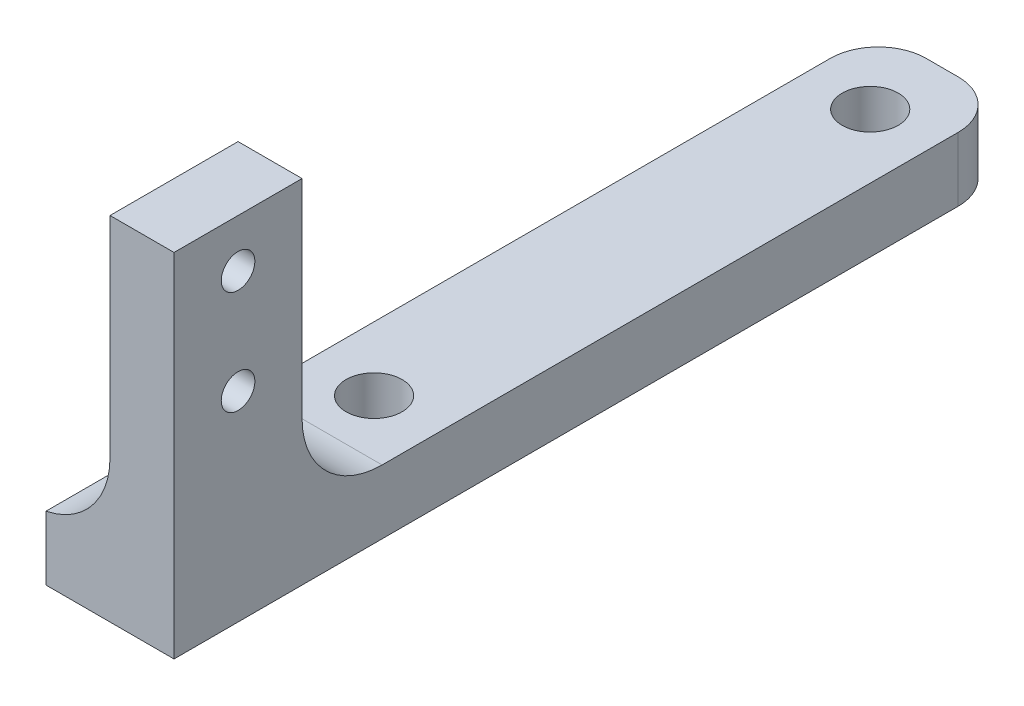
ISO-10303-21;
HEADER;
FILE_DESCRIPTION(('STEP AP214'),'2;1');
FILE_NAME('part.step','',(''),(''),'','','');
FILE_SCHEMA(('AUTOMOTIVE_DESIGN { 1 0 10303 214 1 1 1 1 }'));
ENDSEC;
DATA;
#1=APPLICATION_CONTEXT('core data for automotive mechanical design processes');
#2=APPLICATION_PROTOCOL_DEFINITION('international standard','automotive_design',2000,#1);
#3=PRODUCT_CONTEXT('',#1,'mechanical');
#4=PRODUCT('Part','Part','',(#3));
#5=PRODUCT_RELATED_PRODUCT_CATEGORY('part','',(#4));
#6=PRODUCT_DEFINITION_FORMATION('','',#4);
#7=PRODUCT_DEFINITION_CONTEXT('part definition',#1,'design');
#8=PRODUCT_DEFINITION('design','',#6,#7);
#9=PRODUCT_DEFINITION_SHAPE('','',#8);
#10=(LENGTH_UNIT() NAMED_UNIT(*) SI_UNIT(.MILLI.,.METRE.));
#11=(NAMED_UNIT(*) PLANE_ANGLE_UNIT() SI_UNIT($,.RADIAN.));
#12=(NAMED_UNIT(*) SI_UNIT($,.STERADIAN.) SOLID_ANGLE_UNIT());
#13=UNCERTAINTY_MEASURE_WITH_UNIT(LENGTH_MEASURE(1.E-05),#10,'distance_accuracy_value','');
#14=(GEOMETRIC_REPRESENTATION_CONTEXT(3) GLOBAL_UNCERTAINTY_ASSIGNED_CONTEXT((#13)) GLOBAL_UNIT_ASSIGNED_CONTEXT((#10,
#11,#12)) REPRESENTATION_CONTEXT('',''));
#15=CARTESIAN_POINT('',(0.,0.,0.));
#16=DIRECTION('',(0.,0.,1.));
#17=DIRECTION('',(1.,0.,0.));
#18=AXIS2_PLACEMENT_3D('',#15,#16,#17);
#19=CARTESIAN_POINT('',(0.,4.,0.));
#20=DIRECTION('',(0.,1.,0.));
#21=DIRECTION('',(0.,0.,1.));
#22=AXIS2_PLACEMENT_3D('',#19,#20,#21);
#23=PLANE('',#22);
#24=CARTESIAN_POINT('',(0.,4.,-31.));
#25=DIRECTION('',(0.,1.,0.));
#26=DIRECTION('',(0.,0.,1.));
#27=AXIS2_PLACEMENT_3D('',#24,#25,#26);
#28=CIRCLE('',#27,1.75);
#29=CARTESIAN_POINT('',(0.,4.,-29.25));
#30=VERTEX_POINT('',#29);
#31=EDGE_CURVE('E188',#30,#30,#28,.T.);
#32=ORIENTED_EDGE('',*,*,#31,.F.);
#33=EDGE_LOOP('',(#32));
#34=FACE_BOUND('',#33,.T.);
#35=CARTESIAN_POINT('',(0.,4.,0.));
#36=DIRECTION('',(0.,1.,0.));
#37=DIRECTION('',(0.,0.,1.));
#38=AXIS2_PLACEMENT_3D('',#35,#36,#37);
#39=CIRCLE('',#38,1.75);
#40=CARTESIAN_POINT('',(0.,4.,1.75));
#41=VERTEX_POINT('',#40);
#42=EDGE_CURVE('E192',#41,#41,#39,.T.);
#43=ORIENTED_EDGE('',*,*,#42,.F.);
#44=EDGE_LOOP('',(#43));
#45=FACE_BOUND('',#44,.T.);
#46=DIRECTION('',(0.,0.,-1.));
#47=VECTOR('',#46,1.);
#48=CARTESIAN_POINT('',(4.,4.,0.));
#49=LINE('',#48,#47);
#50=CARTESIAN_POINT('',(4.,4.,3.5));
#51=VERTEX_POINT('',#50);
#52=CARTESIAN_POINT('',(4.,4.,-32.5));
#53=VERTEX_POINT('',#52);
#54=EDGE_CURVE('E176',#51,#53,#49,.T.);
#55=ORIENTED_EDGE('',*,*,#54,.T.);
#56=CARTESIAN_POINT('',(1.,4.,-32.5));
#57=DIRECTION('',(0.,1.,0.));
#58=DIRECTION('',(0.,0.,1.));
#59=AXIS2_PLACEMENT_3D('',#56,#57,#58);
#60=CIRCLE('',#59,3.);
#61=CARTESIAN_POINT('',(1.,4.,-35.5));
#62=VERTEX_POINT('',#61);
#63=EDGE_CURVE('E56',#53,#62,#60,.T.);
#64=ORIENTED_EDGE('',*,*,#63,.T.);
#65=DIRECTION('',(-1.,0.,0.));
#66=VECTOR('',#65,1.);
#67=CARTESIAN_POINT('',(0.,4.,-35.5));
#68=LINE('',#67,#66);
#69=CARTESIAN_POINT('',(-1.,4.,-35.5));
#70=VERTEX_POINT('',#69);
#71=EDGE_CURVE('E179',#62,#70,#68,.T.);
#72=ORIENTED_EDGE('',*,*,#71,.T.);
#73=CARTESIAN_POINT('',(-1.,4.,-32.5));
#74=DIRECTION('',(0.,1.,0.));
#75=DIRECTION('',(0.,0.,1.));
#76=AXIS2_PLACEMENT_3D('',#73,#74,#75);
#77=CIRCLE('',#76,3.);
#78=CARTESIAN_POINT('',(-4.,4.,-32.5));
#79=VERTEX_POINT('',#78);
#80=EDGE_CURVE('E63',#70,#79,#77,.T.);
#81=ORIENTED_EDGE('',*,*,#80,.T.);
#82=DIRECTION('',(0.,0.,-1.));
#83=VECTOR('',#82,1.);
#84=CARTESIAN_POINT('',(-4.,4.,0.));
#85=LINE('',#84,#83);
#86=CARTESIAN_POINT('',(-4.,4.,3.5));
#87=VERTEX_POINT('',#86);
#88=EDGE_CURVE('E183',#87,#79,#85,.T.);
#89=ORIENTED_EDGE('',*,*,#88,.F.);
#90=DIRECTION('',(1.,0.,0.));
#91=VECTOR('',#90,1.);
#92=CARTESIAN_POINT('',(0.,4.,3.5));
#93=LINE('',#92,#91);
#94=EDGE_CURVE('E223',#87,#51,#93,.T.);
#95=ORIENTED_EDGE('',*,*,#94,.T.);
#96=EDGE_LOOP('',(#55,#64,#72,#81,#89,#95));
#97=FACE_BOUND('',#96,.T.);
#98=ADVANCED_FACE('F47',(#34,#45,#97),#23,.T.);
#99=CARTESIAN_POINT('',(0.,4.,16.5));
#100=DIRECTION('',(0.,0.,1.));
#101=DIRECTION('',(1.,0.,0.));
#102=AXIS2_PLACEMENT_3D('',#99,#100,#101);
#103=PLANE('',#102);
#104=DIRECTION('',(0.,-1.,0.));
#105=VECTOR('',#104,1.);
#106=CARTESIAN_POINT('',(0.,22.,16.5));
#107=LINE('',#106,#105);
#108=CARTESIAN_POINT('',(0.,22.,16.5));
#109=VERTEX_POINT('',#108);
#110=CARTESIAN_POINT('',(0.,8.89897948556636,16.5));
#111=VERTEX_POINT('',#110);
#112=EDGE_CURVE('E170',#109,#111,#107,.T.);
#113=ORIENTED_EDGE('',*,*,#112,.T.);
#114=CARTESIAN_POINT('',(-5.,8.89897948556636,16.5));
#115=DIRECTION('',(0.,0.,1.));
#116=DIRECTION('',(1.,0.,0.));
#117=AXIS2_PLACEMENT_3D('',#114,#115,#116);
#118=CIRCLE('',#117,5.);
#119=CARTESIAN_POINT('',(-4.,4.,16.5));
#120=VERTEX_POINT('',#119);
#121=EDGE_CURVE('E232',#111,#120,#118,.F.);
#122=ORIENTED_EDGE('',*,*,#121,.T.);
#123=DIRECTION('',(0.,-1.,0.));
#124=VECTOR('',#123,1.);
#125=CARTESIAN_POINT('',(-4.,4.,16.5));
#126=LINE('',#125,#124);
#127=CARTESIAN_POINT('',(-4.,0.,16.5));
#128=VERTEX_POINT('',#127);
#129=EDGE_CURVE('E196',#120,#128,#126,.T.);
#130=ORIENTED_EDGE('',*,*,#129,.T.);
#131=DIRECTION('',(-1.,0.,0.));
#132=VECTOR('',#131,1.);
#133=CARTESIAN_POINT('',(0.,0.,16.5));
#134=LINE('',#133,#132);
#135=CARTESIAN_POINT('',(4.,0.,16.5));
#136=VERTEX_POINT('',#135);
#137=EDGE_CURVE('E142',#136,#128,#134,.T.);
#138=ORIENTED_EDGE('',*,*,#137,.F.);
#139=DIRECTION('',(0.,-1.,0.));
#140=VECTOR('',#139,1.);
#141=CARTESIAN_POINT('',(4.,4.,16.5));
#142=LINE('',#141,#140);
#143=CARTESIAN_POINT('',(4.,22.,16.5));
#144=VERTEX_POINT('',#143);
#145=EDGE_CURVE('E220',#144,#136,#142,.T.);
#146=ORIENTED_EDGE('',*,*,#145,.F.);
#147=DIRECTION('',(-1.,0.,0.));
#148=VECTOR('',#147,1.);
#149=CARTESIAN_POINT('',(0.,22.,16.5));
#150=LINE('',#149,#148);
#151=EDGE_CURVE('E156',#144,#109,#150,.T.);
#152=ORIENTED_EDGE('',*,*,#151,.T.);
#153=EDGE_LOOP('',(#113,#122,#130,#138,#146,#152));
#154=FACE_BOUND('',#153,.T.);
#155=ADVANCED_FACE('F270',(#154),#103,.T.);
#156=CARTESIAN_POINT('',(4.,4.,0.));
#157=DIRECTION('',(-1.,0.,0.));
#158=DIRECTION('',(0.,0.,1.));
#159=AXIS2_PLACEMENT_3D('',#156,#157,#158);
#160=PLANE('',#159);
#161=CARTESIAN_POINT('',(4.,19.,12.5));
#162=DIRECTION('',(-1.,0.,0.));
#163=DIRECTION('',(0.,0.,1.));
#164=AXIS2_PLACEMENT_3D('',#161,#162,#163);
#165=CIRCLE('',#164,1.05);
#166=CARTESIAN_POINT('',(4.,19.,13.55));
#167=VERTEX_POINT('',#166);
#168=EDGE_CURVE('E158',#167,#167,#165,.T.);
#169=ORIENTED_EDGE('',*,*,#168,.T.);
#170=EDGE_LOOP('',(#169));
#171=FACE_BOUND('',#170,.T.);
#172=CARTESIAN_POINT('',(4.,12.5,12.5));
#173=DIRECTION('',(-1.,0.,0.));
#174=DIRECTION('',(0.,0.,1.));
#175=AXIS2_PLACEMENT_3D('',#172,#173,#174);
#176=CIRCLE('',#175,1.05);
#177=CARTESIAN_POINT('',(4.,12.5,13.55));
#178=VERTEX_POINT('',#177);
#179=EDGE_CURVE('E162',#178,#178,#176,.T.);
#180=ORIENTED_EDGE('',*,*,#179,.T.);
#181=EDGE_LOOP('',(#180));
#182=FACE_BOUND('',#181,.T.);
#183=DIRECTION('',(0.,0.,-1.));
#184=VECTOR('',#183,1.);
#185=CARTESIAN_POINT('',(4.,0.,0.));
#186=LINE('',#185,#184);
#187=CARTESIAN_POINT('',(4.,0.,-32.5));
#188=VERTEX_POINT('',#187);
#189=EDGE_CURVE('E199',#136,#188,#186,.T.);
#190=ORIENTED_EDGE('',*,*,#189,.T.);
#191=DIRECTION('',(0.,-1.,0.));
#192=VECTOR('',#191,1.);
#193=CARTESIAN_POINT('',(4.,4.,-32.5));
#194=LINE('',#193,#192);
#195=EDGE_CURVE('E71',#188,#53,#194,.F.);
#196=ORIENTED_EDGE('',*,*,#195,.T.);
#197=ORIENTED_EDGE('',*,*,#54,.F.);
#198=CARTESIAN_POINT('',(4.,9.,3.5));
#199=DIRECTION('',(-1.,0.,0.));
#200=DIRECTION('',(0.,0.,1.));
#201=AXIS2_PLACEMENT_3D('',#198,#199,#200);
#202=CIRCLE('',#201,5.);
#203=CARTESIAN_POINT('',(4.,9.,8.5));
#204=VERTEX_POINT('',#203);
#205=EDGE_CURVE('E138',#51,#204,#202,.T.);
#206=ORIENTED_EDGE('',*,*,#205,.T.);
#207=DIRECTION('',(0.,-1.,0.));
#208=VECTOR('',#207,1.);
#209=CARTESIAN_POINT('',(4.,22.,8.5));
#210=LINE('',#209,#208);
#211=CARTESIAN_POINT('',(4.,22.,8.5));
#212=VERTEX_POINT('',#211);
#213=EDGE_CURVE('E131',#212,#204,#210,.T.);
#214=ORIENTED_EDGE('',*,*,#213,.F.);
#215=DIRECTION('',(0.,0.,1.));
#216=VECTOR('',#215,1.);
#217=CARTESIAN_POINT('',(4.,22.,0.));
#218=LINE('',#217,#216);
#219=EDGE_CURVE('E135',#212,#144,#218,.T.);
#220=ORIENTED_EDGE('',*,*,#219,.T.);
#221=ORIENTED_EDGE('',*,*,#145,.T.);
#222=EDGE_LOOP('',(#190,#196,#197,#206,#214,#220,#221));
#223=FACE_BOUND('',#222,.T.);
#224=ADVANCED_FACE('F133',(#171,#182,#223),#160,.F.);
#225=CARTESIAN_POINT('',(0.,4.,-35.5));
#226=DIRECTION('',(0.,0.,1.));
#227=DIRECTION('',(1.,0.,0.));
#228=AXIS2_PLACEMENT_3D('',#225,#226,#227);
#229=PLANE('',#228);
#230=ORIENTED_EDGE('',*,*,#71,.F.);
#231=DIRECTION('',(0.,-1.,0.));
#232=VECTOR('',#231,1.);
#233=CARTESIAN_POINT('',(1.,4.,-35.5));
#234=LINE('',#233,#232);
#235=CARTESIAN_POINT('',(1.,0.,-35.5));
#236=VERTEX_POINT('',#235);
#237=EDGE_CURVE('E347',#62,#236,#234,.T.);
#238=ORIENTED_EDGE('',*,*,#237,.T.);
#239=DIRECTION('',(-1.,0.,0.));
#240=VECTOR('',#239,1.);
#241=CARTESIAN_POINT('',(0.,0.,-35.5));
#242=LINE('',#241,#240);
#243=CARTESIAN_POINT('',(-1.,0.,-35.5));
#244=VERTEX_POINT('',#243);
#245=EDGE_CURVE('E202',#236,#244,#242,.T.);
#246=ORIENTED_EDGE('',*,*,#245,.T.);
#247=DIRECTION('',(0.,-1.,0.));
#248=VECTOR('',#247,1.);
#249=CARTESIAN_POINT('',(-1.,4.,-35.5));
#250=LINE('',#249,#248);
#251=EDGE_CURVE('E241',#244,#70,#250,.F.);
#252=ORIENTED_EDGE('',*,*,#251,.T.);
#253=EDGE_LOOP('',(#230,#238,#246,#252));
#254=FACE_BOUND('',#253,.T.);
#255=ADVANCED_FACE('F294',(#254),#229,.F.);
#256=CARTESIAN_POINT('',(0.,4.,-31.));
#257=DIRECTION('',(0.,-1.,0.));
#258=DIRECTION('',(0.,0.,-1.));
#259=AXIS2_PLACEMENT_3D('',#256,#257,#258);
#260=CYLINDRICAL_SURFACE('',#259,1.75);
#261=ORIENTED_EDGE('',*,*,#31,.T.);
#262=EDGE_LOOP('',(#261));
#263=FACE_BOUND('',#262,.T.);
#264=CARTESIAN_POINT('',(0.,0.,-31.));
#265=DIRECTION('',(0.,1.,0.));
#266=DIRECTION('',(0.,0.,1.));
#267=AXIS2_PLACEMENT_3D('',#264,#265,#266);
#268=CIRCLE('',#267,1.75);
#269=CARTESIAN_POINT('',(0.,0.,-29.25));
#270=VERTEX_POINT('',#269);
#271=EDGE_CURVE('E210',#270,#270,#268,.T.);
#272=ORIENTED_EDGE('',*,*,#271,.F.);
#273=EDGE_LOOP('',(#272));
#274=FACE_BOUND('',#273,.T.);
#275=ADVANCED_FACE('F291',(#263,#274),#260,.F.);
#276=CARTESIAN_POINT('',(-4.,4.,0.));
#277=DIRECTION('',(-1.,0.,0.));
#278=DIRECTION('',(0.,0.,1.));
#279=AXIS2_PLACEMENT_3D('',#276,#277,#278);
#280=PLANE('',#279);
#281=ORIENTED_EDGE('',*,*,#88,.T.);
#282=DIRECTION('',(0.,-1.,0.));
#283=VECTOR('',#282,1.);
#284=CARTESIAN_POINT('',(-4.,0.,-32.5));
#285=LINE('',#284,#283);
#286=CARTESIAN_POINT('',(-4.,0.,-32.5));
#287=VERTEX_POINT('',#286);
#288=EDGE_CURVE('E11',#79,#287,#285,.T.);
#289=ORIENTED_EDGE('',*,*,#288,.T.);
#290=DIRECTION('',(0.,0.,-1.));
#291=VECTOR('',#290,1.);
#292=CARTESIAN_POINT('',(-4.,0.,0.));
#293=LINE('',#292,#291);
#294=EDGE_CURVE('E206',#128,#287,#293,.T.);
#295=ORIENTED_EDGE('',*,*,#294,.F.);
#296=ORIENTED_EDGE('',*,*,#129,.F.);
#297=EDGE_CURVE('E184',#120,#87,#85,.T.);
#298=ORIENTED_EDGE('',*,*,#297,.T.);
#299=EDGE_LOOP('',(#281,#289,#295,#296,#298));
#300=FACE_BOUND('',#299,.T.);
#301=ADVANCED_FACE('F289',(#300),#280,.T.);
#302=CARTESIAN_POINT('',(0.,4.,0.));
#303=DIRECTION('',(0.,-1.,0.));
#304=DIRECTION('',(0.,0.,-1.));
#305=AXIS2_PLACEMENT_3D('',#302,#303,#304);
#306=CYLINDRICAL_SURFACE('',#305,1.75);
#307=ORIENTED_EDGE('',*,*,#42,.T.);
#308=EDGE_LOOP('',(#307));
#309=FACE_BOUND('',#308,.T.);
#310=CARTESIAN_POINT('',(0.,0.,0.));
#311=DIRECTION('',(0.,1.,0.));
#312=DIRECTION('',(0.,0.,1.));
#313=AXIS2_PLACEMENT_3D('',#310,#311,#312);
#314=CIRCLE('',#313,1.75);
#315=CARTESIAN_POINT('',(0.,0.,1.75));
#316=VERTEX_POINT('',#315);
#317=EDGE_CURVE('E180',#316,#316,#314,.T.);
#318=ORIENTED_EDGE('',*,*,#317,.F.);
#319=EDGE_LOOP('',(#318));
#320=FACE_BOUND('',#319,.T.);
#321=ADVANCED_FACE('F285',(#309,#320),#306,.F.);
#322=CARTESIAN_POINT('',(0.,0.,0.));
#323=DIRECTION('',(0.,1.,0.));
#324=DIRECTION('',(0.,0.,1.));
#325=AXIS2_PLACEMENT_3D('',#322,#323,#324);
#326=PLANE('',#325);
#327=ORIENTED_EDGE('',*,*,#245,.F.);
#328=CARTESIAN_POINT('',(1.,0.,-32.5));
#329=DIRECTION('',(0.,1.,0.));
#330=DIRECTION('',(0.,0.,1.));
#331=AXIS2_PLACEMENT_3D('',#328,#329,#330);
#332=CIRCLE('',#331,3.);
#333=EDGE_CURVE('E338',#236,#188,#332,.F.);
#334=ORIENTED_EDGE('',*,*,#333,.T.);
#335=ORIENTED_EDGE('',*,*,#189,.F.);
#336=ORIENTED_EDGE('',*,*,#137,.T.);
#337=ORIENTED_EDGE('',*,*,#294,.T.);
#338=CARTESIAN_POINT('',(-1.,0.,-32.5));
#339=DIRECTION('',(0.,1.,0.));
#340=DIRECTION('',(0.,0.,1.));
#341=AXIS2_PLACEMENT_3D('',#338,#339,#340);
#342=CIRCLE('',#341,3.);
#343=EDGE_CURVE('E342',#287,#244,#342,.F.);
#344=ORIENTED_EDGE('',*,*,#343,.T.);
#345=EDGE_LOOP('',(#327,#334,#335,#336,#337,#344));
#346=FACE_BOUND('',#345,.T.);
#347=ORIENTED_EDGE('',*,*,#317,.T.);
#348=EDGE_LOOP('',(#347));
#349=FACE_BOUND('',#348,.T.);
#350=ORIENTED_EDGE('',*,*,#271,.T.);
#351=EDGE_LOOP('',(#350));
#352=FACE_BOUND('',#351,.T.);
#353=ADVANCED_FACE('F283',(#346,#349,#352),#326,.F.);
#354=CARTESIAN_POINT('',(0.,22.,8.5));
#355=DIRECTION('',(0.,0.,1.));
#356=DIRECTION('',(1.,0.,0.));
#357=AXIS2_PLACEMENT_3D('',#354,#355,#356);
#358=PLANE('',#357);
#359=ORIENTED_EDGE('',*,*,#213,.T.);
#360=DIRECTION('',(1.,0.,0.));
#361=VECTOR('',#360,1.);
#362=CARTESIAN_POINT('',(0.,9.,8.5));
#363=LINE('',#362,#361);
#364=CARTESIAN_POINT('',(0.,9.,8.5));
#365=VERTEX_POINT('',#364);
#366=EDGE_CURVE('E229',#204,#365,#363,.F.);
#367=ORIENTED_EDGE('',*,*,#366,.T.);
#368=DIRECTION('',(0.,-1.,0.));
#369=VECTOR('',#368,1.);
#370=CARTESIAN_POINT('',(0.,22.,8.5));
#371=LINE('',#370,#369);
#372=CARTESIAN_POINT('',(0.,22.,8.5));
#373=VERTEX_POINT('',#372);
#374=EDGE_CURVE('E143',#373,#365,#371,.T.);
#375=ORIENTED_EDGE('',*,*,#374,.F.);
#376=DIRECTION('',(-1.,0.,0.));
#377=VECTOR('',#376,1.);
#378=CARTESIAN_POINT('',(0.,22.,8.5));
#379=LINE('',#378,#377);
#380=EDGE_CURVE('E146',#212,#373,#379,.T.);
#381=ORIENTED_EDGE('',*,*,#380,.F.);
#382=EDGE_LOOP('',(#359,#367,#375,#381));
#383=FACE_BOUND('',#382,.T.);
#384=ADVANCED_FACE('F147',(#383),#358,.F.);
#385=CARTESIAN_POINT('',(0.,22.,0.));
#386=DIRECTION('',(1.,0.,0.));
#387=DIRECTION('',(0.,0.,-1.));
#388=AXIS2_PLACEMENT_3D('',#385,#386,#387);
#389=PLANE('',#388);
#390=CARTESIAN_POINT('',(0.,19.,12.5));
#391=DIRECTION('',(-1.,0.,0.));
#392=DIRECTION('',(0.,0.,1.));
#393=AXIS2_PLACEMENT_3D('',#390,#391,#392);
#394=CIRCLE('',#393,1.05);
#395=CARTESIAN_POINT('',(0.,19.,13.55));
#396=VERTEX_POINT('',#395);
#397=EDGE_CURVE('E311',#396,#396,#394,.T.);
#398=ORIENTED_EDGE('',*,*,#397,.F.);
#399=EDGE_LOOP('',(#398));
#400=FACE_BOUND('',#399,.T.);
#401=CARTESIAN_POINT('',(0.,12.5,12.5));
#402=DIRECTION('',(-1.,0.,0.));
#403=DIRECTION('',(0.,0.,1.));
#404=AXIS2_PLACEMENT_3D('',#401,#402,#403);
#405=CIRCLE('',#404,1.05);
#406=CARTESIAN_POINT('',(0.,12.5,13.55));
#407=VERTEX_POINT('',#406);
#408=EDGE_CURVE('E251',#407,#407,#405,.T.);
#409=ORIENTED_EDGE('',*,*,#408,.F.);
#410=EDGE_LOOP('',(#409));
#411=FACE_BOUND('',#410,.T.);
#412=ORIENTED_EDGE('',*,*,#374,.T.);
#413=CARTESIAN_POINT('',(0.,9.,3.5));
#414=DIRECTION('',(1.,0.,0.));
#415=DIRECTION('',(0.,0.,-1.));
#416=AXIS2_PLACEMENT_3D('',#413,#414,#415);
#417=CIRCLE('',#416,5.);
#418=CARTESIAN_POINT('',(0.,8.89897948556636,8.49897938140012));
#419=VERTEX_POINT('',#418);
#420=EDGE_CURVE('E237',#365,#419,#417,.T.);
#421=ORIENTED_EDGE('',*,*,#420,.T.);
#422=DIRECTION('',(0.,0.,1.));
#423=VECTOR('',#422,1.);
#424=CARTESIAN_POINT('',(0.,8.89897948556636,0.));
#425=LINE('',#424,#423);
#426=EDGE_CURVE('E226',#419,#111,#425,.T.);
#427=ORIENTED_EDGE('',*,*,#426,.T.);
#428=ORIENTED_EDGE('',*,*,#112,.F.);
#429=DIRECTION('',(0.,0.,1.));
#430=VECTOR('',#429,1.);
#431=CARTESIAN_POINT('',(0.,22.,0.));
#432=LINE('',#431,#430);
#433=EDGE_CURVE('E152',#373,#109,#432,.T.);
#434=ORIENTED_EDGE('',*,*,#433,.F.);
#435=EDGE_LOOP('',(#412,#421,#427,#428,#434));
#436=FACE_BOUND('',#435,.T.);
#437=ADVANCED_FACE('F322',(#400,#411,#436),#389,.F.);
#438=CARTESIAN_POINT('',(0.,22.,0.));
#439=DIRECTION('',(0.,1.,0.));
#440=DIRECTION('',(0.,0.,1.));
#441=AXIS2_PLACEMENT_3D('',#438,#439,#440);
#442=PLANE('',#441);
#443=ORIENTED_EDGE('',*,*,#219,.F.);
#444=ORIENTED_EDGE('',*,*,#380,.T.);
#445=ORIENTED_EDGE('',*,*,#433,.T.);
#446=ORIENTED_EDGE('',*,*,#151,.F.);
#447=EDGE_LOOP('',(#443,#444,#445,#446));
#448=FACE_BOUND('',#447,.T.);
#449=ADVANCED_FACE('F154',(#448),#442,.T.);
#450=CARTESIAN_POINT('',(15.,12.5,12.5));
#451=DIRECTION('',(-1.,0.,0.));
#452=DIRECTION('',(0.,0.,1.));
#453=AXIS2_PLACEMENT_3D('',#450,#451,#452);
#454=CYLINDRICAL_SURFACE('',#453,1.05);
#455=ORIENTED_EDGE('',*,*,#408,.T.);
#456=EDGE_LOOP('',(#455));
#457=FACE_BOUND('',#456,.T.);
#458=ORIENTED_EDGE('',*,*,#179,.F.);
#459=EDGE_LOOP('',(#458));
#460=FACE_BOUND('',#459,.T.);
#461=ADVANCED_FACE('F320',(#457,#460),#454,.F.);
#462=CARTESIAN_POINT('',(15.,19.,12.5));
#463=DIRECTION('',(-1.,0.,0.));
#464=DIRECTION('',(0.,0.,1.));
#465=AXIS2_PLACEMENT_3D('',#462,#463,#464);
#466=CYLINDRICAL_SURFACE('',#465,1.05);
#467=ORIENTED_EDGE('',*,*,#397,.T.);
#468=EDGE_LOOP('',(#467));
#469=FACE_BOUND('',#468,.T.);
#470=ORIENTED_EDGE('',*,*,#168,.F.);
#471=EDGE_LOOP('',(#470));
#472=FACE_BOUND('',#471,.T.);
#473=ADVANCED_FACE('F365',(#469,#472),#466,.F.);
#474=CARTESIAN_POINT('',(0.,9.,3.5));
#475=DIRECTION('',(1.,0.,0.));
#476=DIRECTION('',(0.,0.,-1.));
#477=AXIS2_PLACEMENT_3D('',#474,#475,#476);
#478=CYLINDRICAL_SURFACE('',#477,5.);
#479=ORIENTED_EDGE('',*,*,#205,.F.);
#480=ORIENTED_EDGE('',*,*,#94,.F.);
#481=CARTESIAN_POINT('',(-4.,4.,3.5));
#482=CARTESIAN_POINT('',(-4.00004665476491,3.99999507935,3.53735915644515));
#483=CARTESIAN_POINT('',(-3.99794812771831,4.0004187083726,3.57467207512216));
#484=CARTESIAN_POINT('',(-3.98986508924225,4.00207680949172,3.64872049888552));
#485=CARTESIAN_POINT('',(-3.9838952249795,4.00330822553624,3.68545764800322));
#486=CARTESIAN_POINT('',(-3.96111708147604,4.00807450275147,3.79279821146469));
#487=CARTESIAN_POINT('',(-3.93940170244648,4.01268616195307,3.86230947892613));
#488=CARTESIAN_POINT('',(-3.88545356135589,4.02470179321056,4.00162501169554));
#489=CARTESIAN_POINT('',(-3.85265170834371,4.03226129968521,4.07117972284414));
#490=CARTESIAN_POINT('',(-3.78089883591304,4.04973570139963,4.20679386771311));
#491=CARTESIAN_POINT('',(-3.741936689135,4.05965487559834,4.27284668194844));
#492=CARTESIAN_POINT('',(-3.65944031594738,4.08184722200467,4.40346499229708));
#493=CARTESIAN_POINT('',(-3.61583017817432,4.09416354198797,4.46797424602584));
#494=CARTESIAN_POINT('',(-3.52620894535444,4.12089087781965,4.59475210862401));
#495=CARTESIAN_POINT('',(-3.480199795294,4.13530021318674,4.65702246553099));
#496=CARTESIAN_POINT('',(-3.36715124227453,4.17259972544879,4.80547596142675));
#497=CARTESIAN_POINT('',(-3.29933844310073,4.1965216580024,4.89080949406705));
#498=CARTESIAN_POINT('',(-3.16212774778671,4.24842825224321,5.05893927039347));
#499=CARTESIAN_POINT('',(-3.09272941402971,4.27641404727962,5.14173479844201));
#500=CARTESIAN_POINT('',(-2.88338007691103,4.36654425162994,5.38720976648311));
#501=CARTESIAN_POINT('',(-2.7424049339972,4.43481984422016,5.54681409359658));
#502=CARTESIAN_POINT('',(-2.46297184781847,4.58751445630033,5.85790171199822));
#503=CARTESIAN_POINT('',(-2.32450292692778,4.67180731301915,6.00943734819624));
#504=CARTESIAN_POINT('',(-2.05155825132558,4.85745695116673,6.30531910098738));
#505=CARTESIAN_POINT('',(-1.91707937493283,4.9587999555909,6.44967090125953));
#506=CARTESIAN_POINT('',(-1.69105115261405,5.14849571798642,6.69099028607342));
#507=CARTESIAN_POINT('',(-1.59800629219268,5.2325653345902,6.78992726807699));
#508=CARTESIAN_POINT('',(-1.41604946604304,5.41021487877128,6.98290943562214));
#509=CARTESIAN_POINT('',(-1.32713775135966,5.50379538293729,7.07695432406196));
#510=CARTESIAN_POINT('',(-1.06805143948149,5.79924705776904,7.35061064824517));
#511=CARTESIAN_POINT('',(-0.905354795407911,6.01596789837582,7.52192517492878));
#512=CARTESIAN_POINT('',(-0.644581284330878,6.43402917822928,7.79684210167409));
#513=CARTESIAN_POINT('',(-0.54028239204953,6.62717437831341,7.90691904443557));
#514=CARTESIAN_POINT('',(-0.40136119976463,6.93300833687237,8.05415539157863));
#515=CARTESIAN_POINT('',(-0.358010697833502,7.03752404183509,8.10021636827432));
#516=CARTESIAN_POINT('',(-0.277801106723071,7.25159189305749,8.18575904997578));
#517=CARTESIAN_POINT('',(-0.24093902040548,7.36114168431806,8.22524379222948));
#518=CARTESIAN_POINT('',(-0.174463488599947,7.58453907777941,8.29689536025901));
#519=CARTESIAN_POINT('',(-0.144838065541503,7.69837921337866,8.32907427177023));
#520=CARTESIAN_POINT('',(-0.0934163153153511,7.92971283381774,8.3855565839847));
#521=CARTESIAN_POINT('',(-0.0716182738462115,8.04720551256919,8.40986170903844));
#522=CARTESIAN_POINT('',(-0.0362071638710329,8.28621138110399,8.45028544140342));
#523=CARTESIAN_POINT('',(-0.0226890133925523,8.40775494388165,8.46630879548254));
#524=CARTESIAN_POINT('',(-0.00455979005896261,8.65248195910949,8.48943555639575));
#525=CARTESIAN_POINT('',(4.10213020391414E-05,8.77566713676403,8.49652868362155));
#526=CARTESIAN_POINT('',(0.,8.89897948556636,8.49897938140013));
#527=B_SPLINE_CURVE_WITH_KNOTS('',3,(#481,#482,#483,#484,#485,#486,#487,#488,#489,#490,#491,
#492,#493,#494,#495,#496,#497,#498,#499,#500,#501,#502,#503,#504,#505,#506,#507,#508,#509,#510,
#511,#512,#513,#514,#515,#516,#517,#518,#519,#520,#521,#522,#523,#524,#525,#526),.UNSPECIFIED.,
.F.,.F.,(4,2,2,2,2,2,2,2,2,2,2,2,2,2,2,2,2,2,2,2,2,2,4),(0.,0.111939419892387,0.223457769769048,
0.441258313977227,0.672576053302905,0.904316499253353,1.14069595603222,1.37688666227902,
1.7115107538925,2.04622834692652,2.71630087506002,3.38129921811051,4.04576278182852,
4.52455483297451,5.00337592777673,5.9601693830091,6.69388121380048,7.05998984085761,
7.42592890813761,7.79125813360885,8.15650729821423,8.52586881101442,8.89565510926947),.UNSPECIFIED.);
#528=EDGE_CURVE('E242',#419,#87,#527,.F.);
#529=ORIENTED_EDGE('',*,*,#528,.F.);
#530=ORIENTED_EDGE('',*,*,#420,.F.);
#531=ORIENTED_EDGE('',*,*,#366,.F.);
#532=EDGE_LOOP('',(#479,#480,#529,#530,#531));
#533=FACE_BOUND('',#532,.T.);
#534=ADVANCED_FACE('F253',(#533),#478,.F.);
#535=CARTESIAN_POINT('',(-5.,8.89897948556636,0.));
#536=DIRECTION('',(0.,0.,1.));
#537=DIRECTION('',(1.,0.,0.));
#538=AXIS2_PLACEMENT_3D('',#535,#536,#537);
#539=CYLINDRICAL_SURFACE('',#538,5.);
#540=ORIENTED_EDGE('',*,*,#121,.F.);
#541=ORIENTED_EDGE('',*,*,#426,.F.);
#542=ORIENTED_EDGE('',*,*,#528,.T.);
#543=ORIENTED_EDGE('',*,*,#297,.F.);
#544=EDGE_LOOP('',(#540,#541,#542,#543));
#545=FACE_BOUND('',#544,.T.);
#546=ADVANCED_FACE('F256',(#545),#539,.F.);
#547=CARTESIAN_POINT('',(1.,4.,-32.5));
#548=DIRECTION('',(0.,-1.,0.));
#549=DIRECTION('',(0.,0.,-1.));
#550=AXIS2_PLACEMENT_3D('',#547,#548,#549);
#551=CYLINDRICAL_SURFACE('',#550,3.);
#552=ORIENTED_EDGE('',*,*,#63,.F.);
#553=ORIENTED_EDGE('',*,*,#195,.F.);
#554=ORIENTED_EDGE('',*,*,#333,.F.);
#555=ORIENTED_EDGE('',*,*,#237,.F.);
#556=EDGE_LOOP('',(#552,#553,#554,#555));
#557=FACE_BOUND('',#556,.T.);
#558=ADVANCED_FACE('F259',(#557),#551,.T.);
#559=CARTESIAN_POINT('',(-1.,4.,-32.5));
#560=DIRECTION('',(0.,1.,0.));
#561=DIRECTION('',(0.,0.,1.));
#562=AXIS2_PLACEMENT_3D('',#559,#560,#561);
#563=CYLINDRICAL_SURFACE('',#562,3.);
#564=ORIENTED_EDGE('',*,*,#80,.F.);
#565=ORIENTED_EDGE('',*,*,#251,.F.);
#566=ORIENTED_EDGE('',*,*,#343,.F.);
#567=ORIENTED_EDGE('',*,*,#288,.F.);
#568=EDGE_LOOP('',(#564,#565,#566,#567));
#569=FACE_BOUND('',#568,.T.);
#570=ADVANCED_FACE('F49',(#569),#563,.T.);
#571=CLOSED_SHELL('',(#98,#155,#224,#255,#275,#301,#321,#353,#384,#437,#449,#461,#473,#534,#546,
#558,#570));
#572=MANIFOLD_SOLID_BREP('B2',#571);
#573=ADVANCED_BREP_SHAPE_REPRESENTATION('',(#18,#572),#14);
#574=SHAPE_DEFINITION_REPRESENTATION(#9,#573);
ENDSEC;
END-ISO-10303-21;
